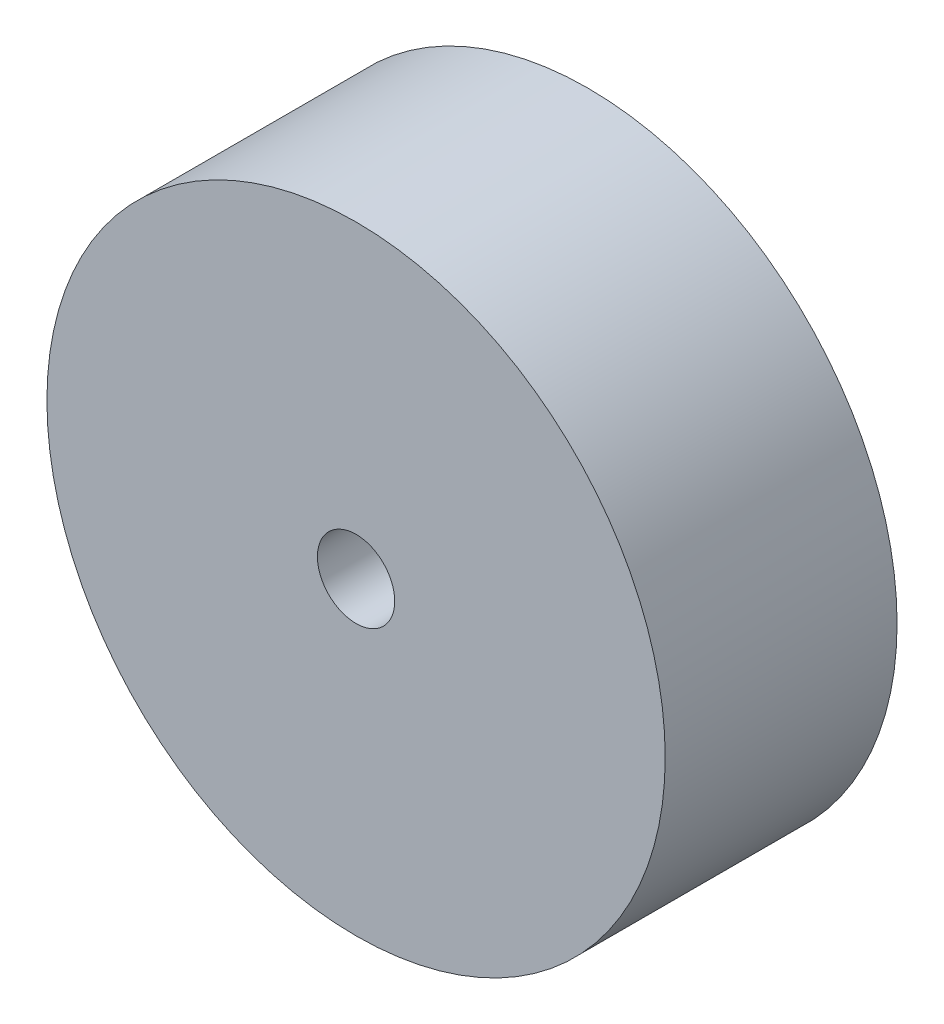
ISO-10303-21;
HEADER;
FILE_DESCRIPTION(('STEP AP214'),'2;1');
FILE_NAME('part.step','',(''),(''),'','','');
FILE_SCHEMA(('AUTOMOTIVE_DESIGN { 1 0 10303 214 1 1 1 1 }'));
ENDSEC;
DATA;
#1=APPLICATION_CONTEXT('core data for automotive mechanical design processes');
#2=APPLICATION_PROTOCOL_DEFINITION('international standard','automotive_design',2000,#1);
#3=PRODUCT_CONTEXT('',#1,'mechanical');
#4=PRODUCT('Part','Part','',(#3));
#5=PRODUCT_RELATED_PRODUCT_CATEGORY('part','',(#4));
#6=PRODUCT_DEFINITION_FORMATION('','',#4);
#7=PRODUCT_DEFINITION_CONTEXT('part definition',#1,'design');
#8=PRODUCT_DEFINITION('design','',#6,#7);
#9=PRODUCT_DEFINITION_SHAPE('','',#8);
#10=(LENGTH_UNIT() NAMED_UNIT(*) SI_UNIT(.MILLI.,.METRE.));
#11=(NAMED_UNIT(*) PLANE_ANGLE_UNIT() SI_UNIT($,.RADIAN.));
#12=(NAMED_UNIT(*) SI_UNIT($,.STERADIAN.) SOLID_ANGLE_UNIT());
#13=UNCERTAINTY_MEASURE_WITH_UNIT(LENGTH_MEASURE(1.E-05),#10,'distance_accuracy_value','');
#14=(GEOMETRIC_REPRESENTATION_CONTEXT(3) GLOBAL_UNCERTAINTY_ASSIGNED_CONTEXT((#13)) GLOBAL_UNIT_ASSIGNED_CONTEXT((#10,
#11,#12)) REPRESENTATION_CONTEXT('',''));
#15=CARTESIAN_POINT('',(0.,0.,0.));
#16=DIRECTION('',(0.,0.,1.));
#17=DIRECTION('',(1.,0.,0.));
#18=AXIS2_PLACEMENT_3D('',#15,#16,#17);
#19=CARTESIAN_POINT('',(0.,0.,19.05));
#20=DIRECTION('',(0.,0.,1.));
#21=DIRECTION('',(1.,0.,0.));
#22=AXIS2_PLACEMENT_3D('',#19,#20,#21);
#23=PLANE('',#22);
#24=CARTESIAN_POINT('',(0.,0.,19.05));
#25=DIRECTION('',(0.,0.,1.));
#26=DIRECTION('',(1.,0.,0.));
#27=AXIS2_PLACEMENT_3D('',#24,#25,#26);
#28=CIRCLE('',#27,25.4);
#29=CARTESIAN_POINT('',(-25.4,0.,19.05));
#30=VERTEX_POINT('',#29);
#31=EDGE_CURVE('E10',#30,#30,#28,.T.);
#32=ORIENTED_EDGE('',*,*,#31,.T.);
#33=EDGE_LOOP('',(#32));
#34=FACE_BOUND('',#33,.T.);
#35=CARTESIAN_POINT('',(0.,0.,19.05));
#36=DIRECTION('',(0.,0.,1.));
#37=DIRECTION('',(1.,0.,0.));
#38=AXIS2_PLACEMENT_3D('',#35,#36,#37);
#39=CIRCLE('',#38,3.175);
#40=CARTESIAN_POINT('',(-3.175,0.,19.05));
#41=VERTEX_POINT('',#40);
#42=EDGE_CURVE('E50',#41,#41,#39,.T.);
#43=ORIENTED_EDGE('',*,*,#42,.F.);
#44=EDGE_LOOP('',(#43));
#45=FACE_BOUND('',#44,.T.);
#46=ADVANCED_FACE('F37',(#34,#45),#23,.T.);
#47=CARTESIAN_POINT('',(0.,0.,0.));
#48=DIRECTION('',(0.,0.,1.));
#49=DIRECTION('',(1.,0.,0.));
#50=AXIS2_PLACEMENT_3D('',#47,#48,#49);
#51=PLANE('',#50);
#52=CARTESIAN_POINT('',(0.,0.,0.));
#53=DIRECTION('',(0.,0.,1.));
#54=DIRECTION('',(1.,0.,0.));
#55=AXIS2_PLACEMENT_3D('',#52,#53,#54);
#56=CIRCLE('',#55,25.4);
#57=CARTESIAN_POINT('',(-25.4,0.,0.));
#58=VERTEX_POINT('',#57);
#59=EDGE_CURVE('E41',#58,#58,#56,.T.);
#60=ORIENTED_EDGE('',*,*,#59,.F.);
#61=EDGE_LOOP('',(#60));
#62=FACE_BOUND('',#61,.T.);
#63=CARTESIAN_POINT('',(0.,0.,0.));
#64=DIRECTION('',(0.,0.,1.));
#65=DIRECTION('',(1.,0.,0.));
#66=AXIS2_PLACEMENT_3D('',#63,#64,#65);
#67=CIRCLE('',#66,3.175);
#68=CARTESIAN_POINT('',(-3.175,0.,0.));
#69=VERTEX_POINT('',#68);
#70=EDGE_CURVE('E52',#69,#69,#67,.T.);
#71=ORIENTED_EDGE('',*,*,#70,.T.);
#72=EDGE_LOOP('',(#71));
#73=FACE_BOUND('',#72,.T.);
#74=ADVANCED_FACE('F64',(#62,#73),#51,.F.);
#75=CARTESIAN_POINT('',(0.,0.,19.05));
#76=DIRECTION('',(0.,0.,-1.));
#77=DIRECTION('',(-1.,0.,0.));
#78=AXIS2_PLACEMENT_3D('',#75,#76,#77);
#79=CYLINDRICAL_SURFACE('',#78,25.4);
#80=CARTESIAN_POINT('',(-25.4,0.,19.05));
#81=CARTESIAN_POINT('',(-25.4,0.,18.8515625));
#82=CARTESIAN_POINT('',(-25.4,0.,18.653125));
#83=CARTESIAN_POINT('',(-25.4,0.,18.25625));
#84=CARTESIAN_POINT('',(-25.4,0.,18.0578125));
#85=CARTESIAN_POINT('',(-25.4,0.,17.6609375));
#86=CARTESIAN_POINT('',(-25.4,0.,17.4625));
#87=CARTESIAN_POINT('',(-25.4,0.,17.065625));
#88=CARTESIAN_POINT('',(-25.4,0.,16.8671875));
#89=CARTESIAN_POINT('',(-25.4,0.,16.4703125));
#90=CARTESIAN_POINT('',(-25.4,0.,16.271875));
#91=CARTESIAN_POINT('',(-25.4,0.,15.875));
#92=CARTESIAN_POINT('',(-25.4,0.,15.6765625));
#93=CARTESIAN_POINT('',(-25.4,0.,15.2796875));
#94=CARTESIAN_POINT('',(-25.4,0.,15.08125));
#95=CARTESIAN_POINT('',(-25.4,0.,14.684375));
#96=CARTESIAN_POINT('',(-25.4,0.,14.4859375));
#97=CARTESIAN_POINT('',(-25.4,0.,14.0890625));
#98=CARTESIAN_POINT('',(-25.4,0.,13.890625));
#99=CARTESIAN_POINT('',(-25.4,0.,13.49375));
#100=CARTESIAN_POINT('',(-25.4,0.,13.2953125));
#101=CARTESIAN_POINT('',(-25.4,0.,12.8984375));
#102=CARTESIAN_POINT('',(-25.4,0.,12.7));
#103=CARTESIAN_POINT('',(-25.4,0.,12.303125));
#104=CARTESIAN_POINT('',(-25.4,0.,12.1046875));
#105=CARTESIAN_POINT('',(-25.4,0.,11.7078125));
#106=CARTESIAN_POINT('',(-25.4,0.,11.509375));
#107=CARTESIAN_POINT('',(-25.4,0.,11.1125));
#108=CARTESIAN_POINT('',(-25.4,0.,10.9140625));
#109=CARTESIAN_POINT('',(-25.4,0.,10.5171875));
#110=CARTESIAN_POINT('',(-25.4,0.,10.31875));
#111=CARTESIAN_POINT('',(-25.4,0.,9.921875));
#112=CARTESIAN_POINT('',(-25.4,0.,9.7234375));
#113=CARTESIAN_POINT('',(-25.4,0.,9.3265625));
#114=CARTESIAN_POINT('',(-25.4,0.,9.128125));
#115=CARTESIAN_POINT('',(-25.4,0.,8.73125));
#116=CARTESIAN_POINT('',(-25.4,0.,8.5328125));
#117=CARTESIAN_POINT('',(-25.4,0.,8.1359375));
#118=CARTESIAN_POINT('',(-25.4,0.,7.9375));
#119=CARTESIAN_POINT('',(-25.4,0.,7.540625));
#120=CARTESIAN_POINT('',(-25.4,0.,7.3421875));
#121=CARTESIAN_POINT('',(-25.4,0.,6.9453125));
#122=CARTESIAN_POINT('',(-25.4,0.,6.746875));
#123=CARTESIAN_POINT('',(-25.4,0.,6.35));
#124=CARTESIAN_POINT('',(-25.4,0.,6.1515625));
#125=CARTESIAN_POINT('',(-25.4,0.,5.7546875));
#126=CARTESIAN_POINT('',(-25.4,0.,5.55625));
#127=CARTESIAN_POINT('',(-25.4,0.,5.159375));
#128=CARTESIAN_POINT('',(-25.4,0.,4.9609375));
#129=CARTESIAN_POINT('',(-25.4,0.,4.5640625));
#130=CARTESIAN_POINT('',(-25.4,0.,4.365625));
#131=CARTESIAN_POINT('',(-25.4,0.,3.96875));
#132=CARTESIAN_POINT('',(-25.4,0.,3.7703125));
#133=CARTESIAN_POINT('',(-25.4,0.,3.3734375));
#134=CARTESIAN_POINT('',(-25.4,0.,3.175));
#135=CARTESIAN_POINT('',(-25.4,0.,2.778125));
#136=CARTESIAN_POINT('',(-25.4,0.,2.5796875));
#137=CARTESIAN_POINT('',(-25.4,0.,2.1828125));
#138=CARTESIAN_POINT('',(-25.4,0.,1.984375));
#139=CARTESIAN_POINT('',(-25.4,0.,1.5875));
#140=CARTESIAN_POINT('',(-25.4,0.,1.3890625));
#141=CARTESIAN_POINT('',(-25.4,0.,0.992187500000001));
#142=CARTESIAN_POINT('',(-25.4,0.,0.793750000000001));
#143=CARTESIAN_POINT('',(-25.4,0.,0.396875));
#144=CARTESIAN_POINT('',(-25.4,0.,0.1984375));
#145=CARTESIAN_POINT('',(-25.4,0.,0.));
#146=B_SPLINE_CURVE_WITH_KNOTS('',3,(#80,#81,#82,#83,#84,#85,#86,#87,#88,#89,#90,#91,#92,#93,
#94,#95,#96,#97,#98,#99,#100,#101,#102,#103,#104,#105,#106,#107,#108,#109,#110,#111,#112,#113,
#114,#115,#116,#117,#118,#119,#120,#121,#122,#123,#124,#125,#126,#127,#128,#129,#130,#131,#132,
#133,#134,#135,#136,#137,#138,#139,#140,#141,#142,#143,#144,#145),.UNSPECIFIED.,.F.,.F.,(4,2,2,
2,2,2,2,2,2,2,2,2,2,2,2,2,2,2,2,2,2,2,2,2,2,2,2,2,2,2,2,2,4),(0.,0.5953125,1.190625,1.7859375,
2.38125,2.9765625,3.571875,4.1671875,4.7625,5.3578125,5.953125,6.5484375,7.14375,7.7390625,
8.334375,8.9296875,9.525,10.1203125,10.715625,11.3109375,11.90625,12.5015625,13.096875,
13.6921875,14.2875,14.8828125,15.478125,16.0734375,16.66875,17.2640625,17.859375,18.4546875,
19.05),.UNSPECIFIED.);
#147=EDGE_CURVE('BSEAM39',#30,#58,#146,.T.);
#148=ORIENTED_EDGE('',*,*,#31,.F.);
#149=ORIENTED_EDGE('',*,*,#59,.T.);
#150=ORIENTED_EDGE('',*,*,#147,.T.);
#151=ORIENTED_EDGE('',*,*,#147,.F.);
#152=EDGE_LOOP('',(#148,#150,#149,#151));
#153=FACE_BOUND('',#152,.T.);
#154=ADVANCED_FACE('F39',(#153),#79,.T.);
#155=CARTESIAN_POINT('',(0.,0.,19.05));
#156=DIRECTION('',(0.,0.,-1.));
#157=DIRECTION('',(-1.,0.,0.));
#158=AXIS2_PLACEMENT_3D('',#155,#156,#157);
#159=CYLINDRICAL_SURFACE('',#158,3.175);
#160=CARTESIAN_POINT('',(-3.175,0.,19.05));
#161=CARTESIAN_POINT('',(-3.175,0.,18.8515625));
#162=CARTESIAN_POINT('',(-3.175,0.,18.653125));
#163=CARTESIAN_POINT('',(-3.175,0.,18.25625));
#164=CARTESIAN_POINT('',(-3.175,0.,18.0578125));
#165=CARTESIAN_POINT('',(-3.175,0.,17.6609375));
#166=CARTESIAN_POINT('',(-3.175,0.,17.4625));
#167=CARTESIAN_POINT('',(-3.175,0.,17.065625));
#168=CARTESIAN_POINT('',(-3.175,0.,16.8671875));
#169=CARTESIAN_POINT('',(-3.175,0.,16.4703125));
#170=CARTESIAN_POINT('',(-3.175,0.,16.271875));
#171=CARTESIAN_POINT('',(-3.175,0.,15.875));
#172=CARTESIAN_POINT('',(-3.175,0.,15.6765625));
#173=CARTESIAN_POINT('',(-3.175,0.,15.2796875));
#174=CARTESIAN_POINT('',(-3.175,0.,15.08125));
#175=CARTESIAN_POINT('',(-3.175,0.,14.684375));
#176=CARTESIAN_POINT('',(-3.175,0.,14.4859375));
#177=CARTESIAN_POINT('',(-3.175,0.,14.0890625));
#178=CARTESIAN_POINT('',(-3.175,0.,13.890625));
#179=CARTESIAN_POINT('',(-3.175,0.,13.49375));
#180=CARTESIAN_POINT('',(-3.175,0.,13.2953125));
#181=CARTESIAN_POINT('',(-3.175,0.,12.8984375));
#182=CARTESIAN_POINT('',(-3.175,0.,12.7));
#183=CARTESIAN_POINT('',(-3.175,0.,12.303125));
#184=CARTESIAN_POINT('',(-3.175,0.,12.1046875));
#185=CARTESIAN_POINT('',(-3.175,0.,11.7078125));
#186=CARTESIAN_POINT('',(-3.175,0.,11.509375));
#187=CARTESIAN_POINT('',(-3.175,0.,11.1125));
#188=CARTESIAN_POINT('',(-3.175,0.,10.9140625));
#189=CARTESIAN_POINT('',(-3.175,0.,10.5171875));
#190=CARTESIAN_POINT('',(-3.175,0.,10.31875));
#191=CARTESIAN_POINT('',(-3.175,0.,9.921875));
#192=CARTESIAN_POINT('',(-3.175,0.,9.7234375));
#193=CARTESIAN_POINT('',(-3.175,0.,9.3265625));
#194=CARTESIAN_POINT('',(-3.175,0.,9.128125));
#195=CARTESIAN_POINT('',(-3.175,0.,8.73125));
#196=CARTESIAN_POINT('',(-3.175,0.,8.5328125));
#197=CARTESIAN_POINT('',(-3.175,0.,8.1359375));
#198=CARTESIAN_POINT('',(-3.175,0.,7.9375));
#199=CARTESIAN_POINT('',(-3.175,0.,7.540625));
#200=CARTESIAN_POINT('',(-3.175,0.,7.3421875));
#201=CARTESIAN_POINT('',(-3.175,0.,6.9453125));
#202=CARTESIAN_POINT('',(-3.175,0.,6.746875));
#203=CARTESIAN_POINT('',(-3.175,0.,6.35));
#204=CARTESIAN_POINT('',(-3.175,0.,6.1515625));
#205=CARTESIAN_POINT('',(-3.175,0.,5.7546875));
#206=CARTESIAN_POINT('',(-3.175,0.,5.55625));
#207=CARTESIAN_POINT('',(-3.175,0.,5.159375));
#208=CARTESIAN_POINT('',(-3.175,0.,4.9609375));
#209=CARTESIAN_POINT('',(-3.175,0.,4.5640625));
#210=CARTESIAN_POINT('',(-3.175,0.,4.365625));
#211=CARTESIAN_POINT('',(-3.175,0.,3.96875));
#212=CARTESIAN_POINT('',(-3.175,0.,3.7703125));
#213=CARTESIAN_POINT('',(-3.175,0.,3.3734375));
#214=CARTESIAN_POINT('',(-3.175,0.,3.175));
#215=CARTESIAN_POINT('',(-3.175,0.,2.778125));
#216=CARTESIAN_POINT('',(-3.175,0.,2.5796875));
#217=CARTESIAN_POINT('',(-3.175,0.,2.1828125));
#218=CARTESIAN_POINT('',(-3.175,0.,1.984375));
#219=CARTESIAN_POINT('',(-3.175,0.,1.5875));
#220=CARTESIAN_POINT('',(-3.175,0.,1.3890625));
#221=CARTESIAN_POINT('',(-3.175,0.,0.992187500000001));
#222=CARTESIAN_POINT('',(-3.175,0.,0.793750000000001));
#223=CARTESIAN_POINT('',(-3.175,0.,0.396875));
#224=CARTESIAN_POINT('',(-3.175,0.,0.1984375));
#225=CARTESIAN_POINT('',(-3.175,0.,0.));
#226=B_SPLINE_CURVE_WITH_KNOTS('',3,(#160,#161,#162,#163,#164,#165,#166,#167,#168,#169,#170,
#171,#172,#173,#174,#175,#176,#177,#178,#179,#180,#181,#182,#183,#184,#185,#186,#187,#188,#189,
#190,#191,#192,#193,#194,#195,#196,#197,#198,#199,#200,#201,#202,#203,#204,#205,#206,#207,#208,
#209,#210,#211,#212,#213,#214,#215,#216,#217,#218,#219,#220,#221,#222,#223,#224,#225),
.UNSPECIFIED.,.F.,.F.,(4,2,2,2,2,2,2,2,2,2,2,2,2,2,2,2,2,2,2,2,2,2,2,2,2,2,2,2,2,2,2,2,4),(0.,
0.595312499999997,1.190625,1.7859375,2.38125,2.9765625,3.571875,4.1671875,4.7625,5.3578125,
5.953125,6.5484375,7.14375,7.7390625,8.334375,8.9296875,9.525,10.1203125,10.715625,11.3109375,
11.90625,12.5015625,13.096875,13.6921875,14.2875,14.8828125,15.478125,16.0734375,16.66875,
17.2640625,17.859375,18.4546875,19.05),.UNSPECIFIED.);
#227=EDGE_CURVE('BSEAM60',#41,#69,#226,.T.);
#228=ORIENTED_EDGE('',*,*,#42,.T.);
#229=ORIENTED_EDGE('',*,*,#70,.F.);
#230=ORIENTED_EDGE('',*,*,#227,.T.);
#231=ORIENTED_EDGE('',*,*,#227,.F.);
#232=EDGE_LOOP('',(#228,#230,#229,#231));
#233=FACE_BOUND('',#232,.T.);
#234=ADVANCED_FACE('F60',(#233),#159,.F.);
#235=CLOSED_SHELL('',(#46,#74,#154,#234));
#236=MANIFOLD_SOLID_BREP('B2',#235);
#237=ADVANCED_BREP_SHAPE_REPRESENTATION('',(#18,#236),#14);
#238=SHAPE_DEFINITION_REPRESENTATION(#9,#237);
ENDSEC;
END-ISO-10303-21;
